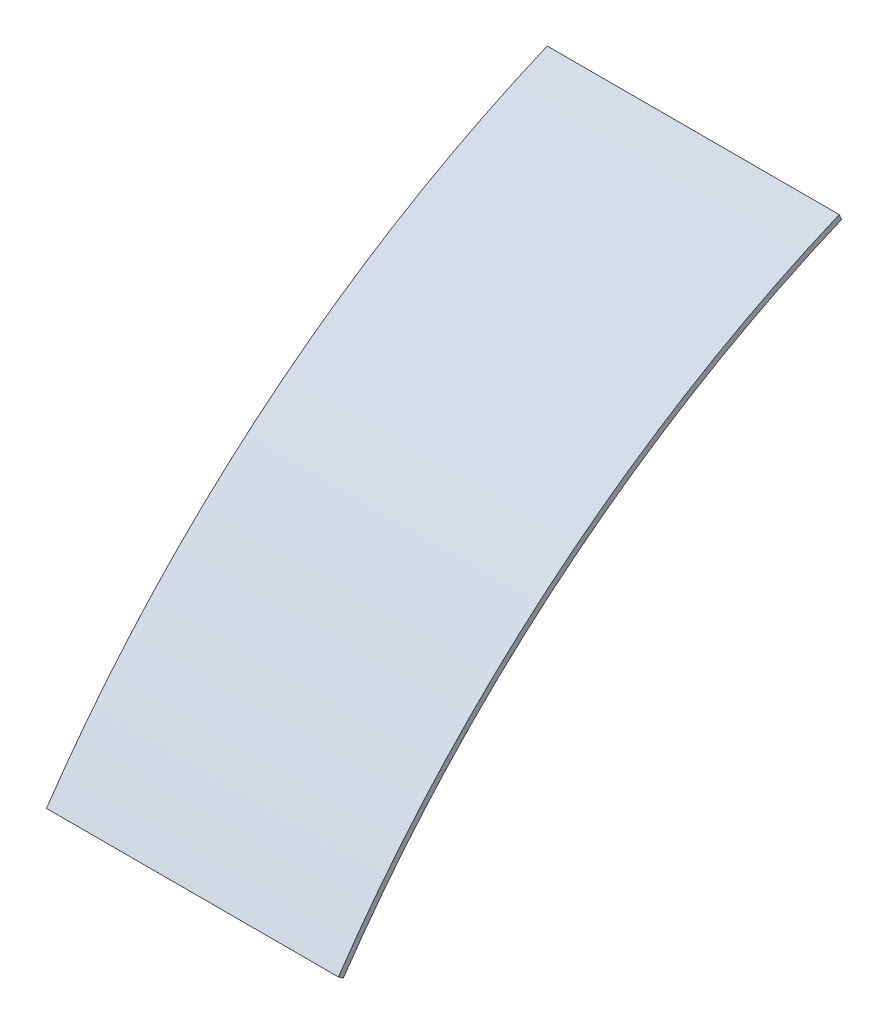
ISO-10303-21;
HEADER;
FILE_DESCRIPTION(('STEP AP214'),'2;1');
FILE_NAME('part.step','',(''),(''),'','','');
FILE_SCHEMA(('AUTOMOTIVE_DESIGN { 1 0 10303 214 1 1 1 1 }'));
ENDSEC;
DATA;
#1=APPLICATION_CONTEXT('core data for automotive mechanical design processes');
#2=APPLICATION_PROTOCOL_DEFINITION('international standard','automotive_design',2000,#1);
#3=PRODUCT_CONTEXT('',#1,'mechanical');
#4=PRODUCT('Part','Part','',(#3));
#5=PRODUCT_RELATED_PRODUCT_CATEGORY('part','',(#4));
#6=PRODUCT_DEFINITION_FORMATION('','',#4);
#7=PRODUCT_DEFINITION_CONTEXT('part definition',#1,'design');
#8=PRODUCT_DEFINITION('design','',#6,#7);
#9=PRODUCT_DEFINITION_SHAPE('','',#8);
#10=(LENGTH_UNIT() NAMED_UNIT(*) SI_UNIT(.MILLI.,.METRE.));
#11=(NAMED_UNIT(*) PLANE_ANGLE_UNIT() SI_UNIT($,.RADIAN.));
#12=(NAMED_UNIT(*) SI_UNIT($,.STERADIAN.) SOLID_ANGLE_UNIT());
#13=UNCERTAINTY_MEASURE_WITH_UNIT(LENGTH_MEASURE(1.E-05),#10,'distance_accuracy_value','');
#14=(GEOMETRIC_REPRESENTATION_CONTEXT(3) GLOBAL_UNCERTAINTY_ASSIGNED_CONTEXT((#13)) GLOBAL_UNIT_ASSIGNED_CONTEXT((#10,
#11,#12)) REPRESENTATION_CONTEXT('',''));
#15=CARTESIAN_POINT('',(0.,0.,0.));
#16=DIRECTION('',(0.,0.,1.));
#17=DIRECTION('',(1.,0.,0.));
#18=AXIS2_PLACEMENT_3D('',#15,#16,#17);
#19=CARTESIAN_POINT('',(146.2024,0.,0.));
#20=DIRECTION('',(0.,0.388415053767308,-0.921484533786075));
#21=DIRECTION('',(0.,0.921484533786075,0.388415053767308));
#22=AXIS2_PLACEMENT_3D('',#19,#20,#21);
#23=PLANE('',#22);
#24=DIRECTION('',(0.,-0.921484533786075,-0.388415053767308));
#25=VECTOR('',#24,1.);
#26=CARTESIAN_POINT('',(0.,0.,0.));
#27=LINE('',#26,#25);
#28=CARTESIAN_POINT('',(0.,0.,0.));
#29=VERTEX_POINT('',#28);
#30=CARTESIAN_POINT('',(0.,-2.76187346294068,-1.16415760685534));
#31=VERTEX_POINT('',#30);
#32=EDGE_CURVE('E109',#29,#31,#27,.T.);
#33=ORIENTED_EDGE('',*,*,#32,.F.);
#34=DIRECTION('',(-1.,0.,0.));
#35=VECTOR('',#34,1.);
#36=CARTESIAN_POINT('',(146.2024,0.,0.));
#37=LINE('',#36,#35);
#38=CARTESIAN_POINT('',(146.2024,0.,0.));
#39=VERTEX_POINT('',#38);
#40=EDGE_CURVE('E11',#39,#29,#37,.T.);
#41=ORIENTED_EDGE('',*,*,#40,.F.);
#42=DIRECTION('',(0.,-0.921484533786075,-0.388415053767308));
#43=VECTOR('',#42,1.);
#44=CARTESIAN_POINT('',(146.2024,0.,0.));
#45=LINE('',#44,#43);
#46=CARTESIAN_POINT('',(146.2024,-2.76187346294068,-1.16415760685534));
#47=VERTEX_POINT('',#46);
#48=EDGE_CURVE('E90',#39,#47,#45,.T.);
#49=ORIENTED_EDGE('',*,*,#48,.T.);
#50=DIRECTION('',(-1.,0.,0.));
#51=VECTOR('',#50,1.);
#52=CARTESIAN_POINT('',(146.2024,-2.76187346294068,-1.16415760685534));
#53=LINE('',#52,#51);
#54=EDGE_CURVE('E58',#47,#31,#53,.T.);
#55=ORIENTED_EDGE('',*,*,#54,.T.);
#56=EDGE_LOOP('',(#33,#41,#49,#55));
#57=FACE_BOUND('',#56,.T.);
#58=ADVANCED_FACE('F41',(#57),#23,.T.);
#59=CARTESIAN_POINT('',(146.2024,-527.262835858828,-222.17536785383));
#60=DIRECTION('',(-1.,0.,0.));
#61=DIRECTION('',(0.,0.,1.));
#62=AXIS2_PLACEMENT_3D('',#59,#60,#61);
#63=CYLINDRICAL_SURFACE('',#62,572.160809702008);
#64=CARTESIAN_POINT('',(0.,-527.262835858828,-222.17536785383));
#65=DIRECTION('',(1.,0.,0.));
#66=DIRECTION('',(0.,0.,-1.));
#67=AXIS2_PLACEMENT_3D('',#64,#65,#66);
#68=CIRCLE('',#67,572.160809702008);
#69=CARTESIAN_POINT('',(0.,-205.224222469771,250.750761309372));
#70=VERTEX_POINT('',#69);
#71=EDGE_CURVE('E97',#29,#70,#68,.T.);
#72=ORIENTED_EDGE('',*,*,#71,.T.);
#73=DIRECTION('',(-1.,0.,0.));
#74=VECTOR('',#73,1.);
#75=CARTESIAN_POINT('',(146.2024,-205.224222469771,250.750761309372));
#76=LINE('',#75,#74);
#77=CARTESIAN_POINT('',(146.2024,-205.224222469771,250.750761309372));
#78=VERTEX_POINT('',#77);
#79=EDGE_CURVE('E50',#78,#70,#76,.T.);
#80=ORIENTED_EDGE('',*,*,#79,.F.);
#81=CARTESIAN_POINT('',(146.2024,-527.262835858828,-222.17536785383));
#82=DIRECTION('',(1.,0.,0.));
#83=DIRECTION('',(0.,0.,-1.));
#84=AXIS2_PLACEMENT_3D('',#81,#82,#83);
#85=CIRCLE('',#84,572.160809702008);
#86=EDGE_CURVE('E84',#39,#78,#85,.T.);
#87=ORIENTED_EDGE('',*,*,#86,.F.);
#88=ORIENTED_EDGE('',*,*,#40,.T.);
#89=EDGE_LOOP('',(#72,#80,#87,#88));
#90=FACE_BOUND('',#89,.T.);
#91=ADVANCED_FACE('F95',(#90),#63,.T.);
#92=CARTESIAN_POINT('',(146.2024,-256.86607055124,174.912714874607));
#93=DIRECTION('',(0.,-0.826561556023771,0.562846332584269));
#94=DIRECTION('',(0.,-0.562846332584269,-0.826561556023771));
#95=AXIS2_PLACEMENT_3D('',#92,#93,#94);
#96=PLANE('',#95);
#97=DIRECTION('',(0.,0.562846332584269,0.826561556023771));
#98=VECTOR('',#97,1.);
#99=CARTESIAN_POINT('',(0.,-256.86607055124,174.912714874607));
#100=LINE('',#99,#98);
#101=CARTESIAN_POINT('',(0.,-206.911185497783,248.27339101367));
#102=VERTEX_POINT('',#101);
#103=EDGE_CURVE('E114',#102,#70,#100,.T.);
#104=ORIENTED_EDGE('',*,*,#103,.F.);
#105=DIRECTION('',(-1.,0.,0.));
#106=VECTOR('',#105,1.);
#107=CARTESIAN_POINT('',(146.2024,-206.911185497783,248.27339101367));
#108=LINE('',#107,#106);
#109=CARTESIAN_POINT('',(146.2024,-206.911185497783,248.27339101367));
#110=VERTEX_POINT('',#109);
#111=EDGE_CURVE('E71',#110,#102,#108,.T.);
#112=ORIENTED_EDGE('',*,*,#111,.F.);
#113=DIRECTION('',(0.,0.562846332584269,0.826561556023771));
#114=VECTOR('',#113,1.);
#115=CARTESIAN_POINT('',(146.2024,-256.86607055124,174.912714874607));
#116=LINE('',#115,#114);
#117=EDGE_CURVE('E89',#110,#78,#116,.T.);
#118=ORIENTED_EDGE('',*,*,#117,.T.);
#119=ORIENTED_EDGE('',*,*,#79,.T.);
#120=EDGE_LOOP('',(#104,#112,#118,#119));
#121=FACE_BOUND('',#120,.T.);
#122=ADVANCED_FACE('F101',(#121),#96,.T.);
#123=CARTESIAN_POINT('',(146.2024,-527.262835858828,-222.17536785383));
#124=DIRECTION('',(-1.,0.,0.));
#125=DIRECTION('',(0.,0.,1.));
#126=AXIS2_PLACEMENT_3D('',#123,#124,#125);
#127=CYLINDRICAL_SURFACE('',#126,569.163609702018);
#128=CARTESIAN_POINT('',(0.,-527.262835858828,-222.17536785383));
#129=DIRECTION('',(1.,0.,0.));
#130=DIRECTION('',(0.,0.,-1.));
#131=AXIS2_PLACEMENT_3D('',#128,#129,#130);
#132=CIRCLE('',#131,569.163609702018);
#133=EDGE_CURVE('E117',#31,#102,#132,.T.);
#134=ORIENTED_EDGE('',*,*,#133,.F.);
#135=ORIENTED_EDGE('',*,*,#54,.F.);
#136=CARTESIAN_POINT('',(146.2024,-527.262835858828,-222.17536785383));
#137=DIRECTION('',(1.,0.,0.));
#138=DIRECTION('',(0.,0.,-1.));
#139=AXIS2_PLACEMENT_3D('',#136,#137,#138);
#140=CIRCLE('',#139,569.163609702018);
#141=EDGE_CURVE('E103',#47,#110,#140,.T.);
#142=ORIENTED_EDGE('',*,*,#141,.T.);
#143=ORIENTED_EDGE('',*,*,#111,.T.);
#144=EDGE_LOOP('',(#134,#135,#142,#143));
#145=FACE_BOUND('',#144,.T.);
#146=ADVANCED_FACE('F126',(#145),#127,.F.);
#147=CARTESIAN_POINT('',(146.2024,0.,0.));
#148=DIRECTION('',(1.,0.,0.));
#149=DIRECTION('',(0.,0.,-1.));
#150=AXIS2_PLACEMENT_3D('',#147,#148,#149);
#151=PLANE('',#150);
#152=ORIENTED_EDGE('',*,*,#48,.F.);
#153=ORIENTED_EDGE('',*,*,#86,.T.);
#154=ORIENTED_EDGE('',*,*,#117,.F.);
#155=ORIENTED_EDGE('',*,*,#141,.F.);
#156=EDGE_LOOP('',(#152,#153,#154,#155));
#157=FACE_BOUND('',#156,.T.);
#158=ADVANCED_FACE('F86',(#157),#151,.T.);
#159=CARTESIAN_POINT('',(0.,0.,0.));
#160=DIRECTION('',(1.,0.,0.));
#161=DIRECTION('',(0.,0.,-1.));
#162=AXIS2_PLACEMENT_3D('',#159,#160,#161);
#163=PLANE('',#162);
#164=ORIENTED_EDGE('',*,*,#32,.T.);
#165=ORIENTED_EDGE('',*,*,#133,.T.);
#166=ORIENTED_EDGE('',*,*,#103,.T.);
#167=ORIENTED_EDGE('',*,*,#71,.F.);
#168=EDGE_LOOP('',(#164,#165,#166,#167));
#169=FACE_BOUND('',#168,.T.);
#170=ADVANCED_FACE('F133',(#169),#163,.F.);
#171=CLOSED_SHELL('',(#58,#91,#122,#146,#158,#170));
#172=MANIFOLD_SOLID_BREP('B2',#171);
#173=ADVANCED_BREP_SHAPE_REPRESENTATION('',(#18,#172),#14);
#174=SHAPE_DEFINITION_REPRESENTATION(#9,#173);
ENDSEC;
END-ISO-10303-21;
